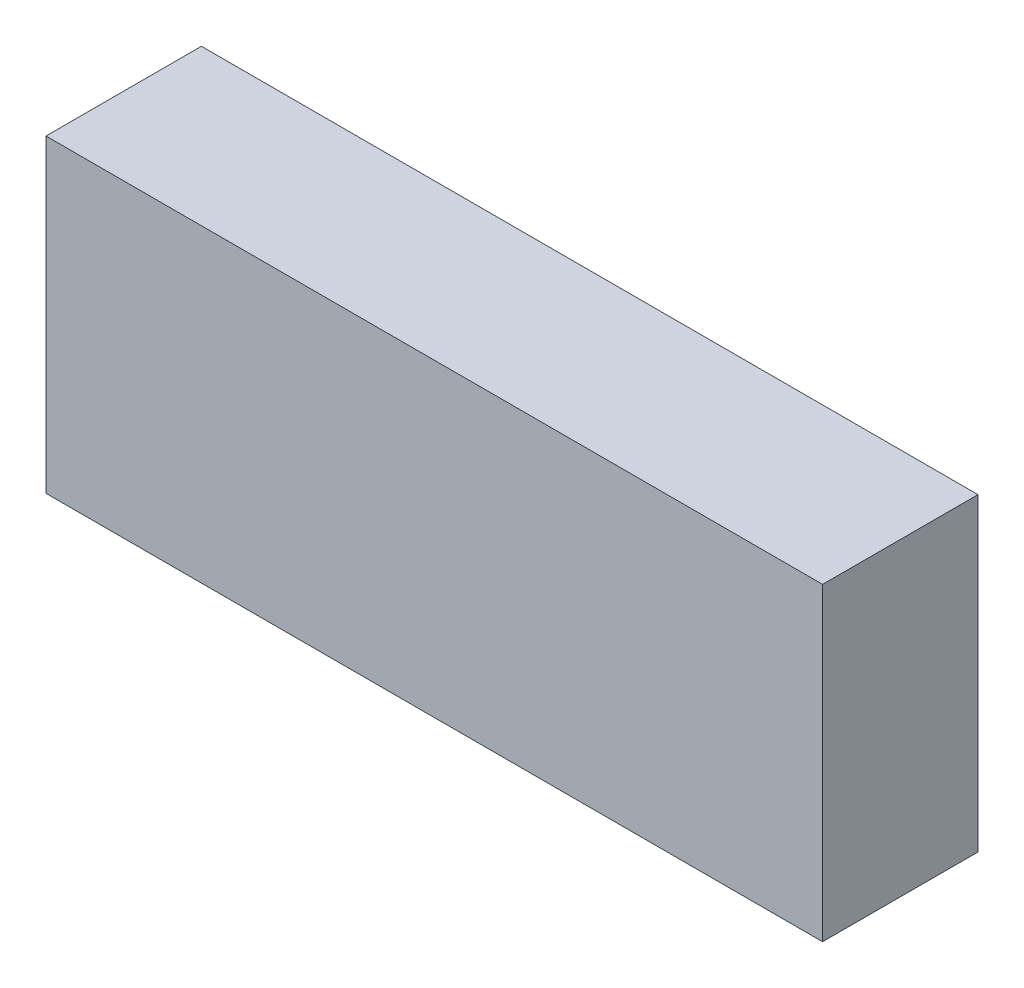
ISO-10303-21;
HEADER;
FILE_DESCRIPTION(('STEP AP214'),'2;1');
FILE_NAME('part.step','',(''),(''),'','','');
FILE_SCHEMA(('AUTOMOTIVE_DESIGN { 1 0 10303 214 1 1 1 1 }'));
ENDSEC;
DATA;
#1=APPLICATION_CONTEXT('core data for automotive mechanical design processes');
#2=APPLICATION_PROTOCOL_DEFINITION('international standard','automotive_design',2000,#1);
#3=PRODUCT_CONTEXT('',#1,'mechanical');
#4=PRODUCT('Part','Part','',(#3));
#5=PRODUCT_RELATED_PRODUCT_CATEGORY('part','',(#4));
#6=PRODUCT_DEFINITION_FORMATION('','',#4);
#7=PRODUCT_DEFINITION_CONTEXT('part definition',#1,'design');
#8=PRODUCT_DEFINITION('design','',#6,#7);
#9=PRODUCT_DEFINITION_SHAPE('','',#8);
#10=(LENGTH_UNIT() NAMED_UNIT(*) SI_UNIT(.MILLI.,.METRE.));
#11=(NAMED_UNIT(*) PLANE_ANGLE_UNIT() SI_UNIT($,.RADIAN.));
#12=(NAMED_UNIT(*) SI_UNIT($,.STERADIAN.) SOLID_ANGLE_UNIT());
#13=UNCERTAINTY_MEASURE_WITH_UNIT(LENGTH_MEASURE(1.E-05),#10,'distance_accuracy_value','');
#14=(GEOMETRIC_REPRESENTATION_CONTEXT(3) GLOBAL_UNCERTAINTY_ASSIGNED_CONTEXT((#13)) GLOBAL_UNIT_ASSIGNED_CONTEXT((#10,
#11,#12)) REPRESENTATION_CONTEXT('',''));
#15=CARTESIAN_POINT('',(0.,0.,0.));
#16=DIRECTION('',(0.,0.,1.));
#17=DIRECTION('',(1.,0.,0.));
#18=AXIS2_PLACEMENT_3D('',#15,#16,#17);
#19=CARTESIAN_POINT('',(-2.4984,-0.983,1.));
#20=DIRECTION('',(1.,0.,0.));
#21=DIRECTION('',(0.,0.,-1.));
#22=AXIS2_PLACEMENT_3D('',#19,#20,#21);
#23=PLANE('',#22);
#24=DIRECTION('',(0.,-1.,0.));
#25=VECTOR('',#24,1.);
#26=CARTESIAN_POINT('',(-2.4984,-0.983,0.));
#27=LINE('',#26,#25);
#28=CARTESIAN_POINT('',(-2.4984,1.0084,0.));
#29=VERTEX_POINT('',#28);
#30=CARTESIAN_POINT('',(-2.4984,-0.983,0.));
#31=VERTEX_POINT('',#30);
#32=EDGE_CURVE('E95',#29,#31,#27,.T.);
#33=ORIENTED_EDGE('',*,*,#32,.T.);
#34=DIRECTION('',(0.,0.,-1.));
#35=VECTOR('',#34,1.);
#36=CARTESIAN_POINT('',(-2.4984,-0.983,1.));
#37=LINE('',#36,#35);
#38=CARTESIAN_POINT('',(-2.4984,-0.983,1.));
#39=VERTEX_POINT('',#38);
#40=EDGE_CURVE('E11',#39,#31,#37,.T.);
#41=ORIENTED_EDGE('',*,*,#40,.F.);
#42=DIRECTION('',(0.,-1.,0.));
#43=VECTOR('',#42,1.);
#44=CARTESIAN_POINT('',(-2.4984,-0.983,1.));
#45=LINE('',#44,#43);
#46=CARTESIAN_POINT('',(-2.4984,1.0084,1.));
#47=VERTEX_POINT('',#46);
#48=EDGE_CURVE('E83',#47,#39,#45,.T.);
#49=ORIENTED_EDGE('',*,*,#48,.F.);
#50=DIRECTION('',(0.,0.,-1.));
#51=VECTOR('',#50,1.);
#52=CARTESIAN_POINT('',(-2.4984,1.0084,1.));
#53=LINE('',#52,#51);
#54=EDGE_CURVE('E91',#47,#29,#53,.T.);
#55=ORIENTED_EDGE('',*,*,#54,.T.);
#56=EDGE_LOOP('',(#33,#41,#49,#55));
#57=FACE_BOUND('',#56,.T.);
#58=ADVANCED_FACE('F32',(#57),#23,.F.);
#59=CARTESIAN_POINT('',(2.4984,-0.983,1.));
#60=DIRECTION('',(0.,1.,0.));
#61=DIRECTION('',(0.,0.,1.));
#62=AXIS2_PLACEMENT_3D('',#59,#60,#61);
#63=PLANE('',#62);
#64=DIRECTION('',(1.,0.,0.));
#65=VECTOR('',#64,1.);
#66=CARTESIAN_POINT('',(2.4984,-0.983,0.));
#67=LINE('',#66,#65);
#68=CARTESIAN_POINT('',(2.4984,-0.983,0.));
#69=VERTEX_POINT('',#68);
#70=EDGE_CURVE('E87',#31,#69,#67,.T.);
#71=ORIENTED_EDGE('',*,*,#70,.T.);
#72=DIRECTION('',(0.,0.,-1.));
#73=VECTOR('',#72,1.);
#74=CARTESIAN_POINT('',(2.4984,-0.983,1.));
#75=LINE('',#74,#73);
#76=CARTESIAN_POINT('',(2.4984,-0.983,1.));
#77=VERTEX_POINT('',#76);
#78=EDGE_CURVE('E40',#77,#69,#75,.T.);
#79=ORIENTED_EDGE('',*,*,#78,.F.);
#80=DIRECTION('',(1.,0.,0.));
#81=VECTOR('',#80,1.);
#82=CARTESIAN_POINT('',(2.4984,-0.983,1.));
#83=LINE('',#82,#81);
#84=EDGE_CURVE('E78',#39,#77,#83,.T.);
#85=ORIENTED_EDGE('',*,*,#84,.F.);
#86=ORIENTED_EDGE('',*,*,#40,.T.);
#87=EDGE_LOOP('',(#71,#79,#85,#86));
#88=FACE_BOUND('',#87,.T.);
#89=ADVANCED_FACE('F86',(#88),#63,.F.);
#90=CARTESIAN_POINT('',(2.4984,1.0084,1.));
#91=DIRECTION('',(-1.,0.,0.));
#92=DIRECTION('',(0.,0.,1.));
#93=AXIS2_PLACEMENT_3D('',#90,#91,#92);
#94=PLANE('',#93);
#95=DIRECTION('',(0.,1.,0.));
#96=VECTOR('',#95,1.);
#97=CARTESIAN_POINT('',(2.4984,1.0084,0.));
#98=LINE('',#97,#96);
#99=CARTESIAN_POINT('',(2.4984,1.0084,0.));
#100=VERTEX_POINT('',#99);
#101=EDGE_CURVE('E65',#69,#100,#98,.T.);
#102=ORIENTED_EDGE('',*,*,#101,.T.);
#103=DIRECTION('',(0.,0.,-1.));
#104=VECTOR('',#103,1.);
#105=CARTESIAN_POINT('',(2.4984,1.0084,1.));
#106=LINE('',#105,#104);
#107=CARTESIAN_POINT('',(2.4984,1.0084,1.));
#108=VERTEX_POINT('',#107);
#109=EDGE_CURVE('E88',#108,#100,#106,.T.);
#110=ORIENTED_EDGE('',*,*,#109,.F.);
#111=DIRECTION('',(0.,1.,0.));
#112=VECTOR('',#111,1.);
#113=CARTESIAN_POINT('',(2.4984,1.0084,1.));
#114=LINE('',#113,#112);
#115=EDGE_CURVE('E81',#77,#108,#114,.T.);
#116=ORIENTED_EDGE('',*,*,#115,.F.);
#117=ORIENTED_EDGE('',*,*,#78,.T.);
#118=EDGE_LOOP('',(#102,#110,#116,#117));
#119=FACE_BOUND('',#118,.T.);
#120=ADVANCED_FACE('F89',(#119),#94,.F.);
#121=CARTESIAN_POINT('',(-2.4984,1.0084,1.));
#122=DIRECTION('',(0.,-1.,0.));
#123=DIRECTION('',(0.,0.,-1.));
#124=AXIS2_PLACEMENT_3D('',#121,#122,#123);
#125=PLANE('',#124);
#126=DIRECTION('',(-1.,0.,0.));
#127=VECTOR('',#126,1.);
#128=CARTESIAN_POINT('',(-2.4984,1.0084,0.));
#129=LINE('',#128,#127);
#130=EDGE_CURVE('E71',#100,#29,#129,.T.);
#131=ORIENTED_EDGE('',*,*,#130,.T.);
#132=ORIENTED_EDGE('',*,*,#54,.F.);
#133=DIRECTION('',(-1.,0.,0.));
#134=VECTOR('',#133,1.);
#135=CARTESIAN_POINT('',(-2.4984,1.0084,1.));
#136=LINE('',#135,#134);
#137=EDGE_CURVE('E48',#108,#47,#136,.T.);
#138=ORIENTED_EDGE('',*,*,#137,.F.);
#139=ORIENTED_EDGE('',*,*,#109,.T.);
#140=EDGE_LOOP('',(#131,#132,#138,#139));
#141=FACE_BOUND('',#140,.T.);
#142=ADVANCED_FACE('F102',(#141),#125,.F.);
#143=CARTESIAN_POINT('',(0.,0.,1.));
#144=DIRECTION('',(0.,0.,-1.));
#145=DIRECTION('',(-1.,0.,0.));
#146=AXIS2_PLACEMENT_3D('',#143,#144,#145);
#147=PLANE('',#146);
#148=ORIENTED_EDGE('',*,*,#48,.T.);
#149=ORIENTED_EDGE('',*,*,#84,.T.);
#150=ORIENTED_EDGE('',*,*,#115,.T.);
#151=ORIENTED_EDGE('',*,*,#137,.T.);
#152=EDGE_LOOP('',(#148,#149,#150,#151));
#153=FACE_BOUND('',#152,.T.);
#154=ADVANCED_FACE('F79',(#153),#147,.F.);
#155=CARTESIAN_POINT('',(0.,0.,0.));
#156=DIRECTION('',(0.,0.,-1.));
#157=DIRECTION('',(-1.,0.,0.));
#158=AXIS2_PLACEMENT_3D('',#155,#156,#157);
#159=PLANE('',#158);
#160=ORIENTED_EDGE('',*,*,#32,.F.);
#161=ORIENTED_EDGE('',*,*,#130,.F.);
#162=ORIENTED_EDGE('',*,*,#101,.F.);
#163=ORIENTED_EDGE('',*,*,#70,.F.);
#164=EDGE_LOOP('',(#160,#161,#162,#163));
#165=FACE_BOUND('',#164,.T.);
#166=ADVANCED_FACE('F105',(#165),#159,.T.);
#167=CLOSED_SHELL('',(#58,#89,#120,#142,#154,#166));
#168=MANIFOLD_SOLID_BREP('B2',#167);
#169=ADVANCED_BREP_SHAPE_REPRESENTATION('',(#18,#168),#14);
#170=SHAPE_DEFINITION_REPRESENTATION(#9,#169);
ENDSEC;
END-ISO-10303-21;
